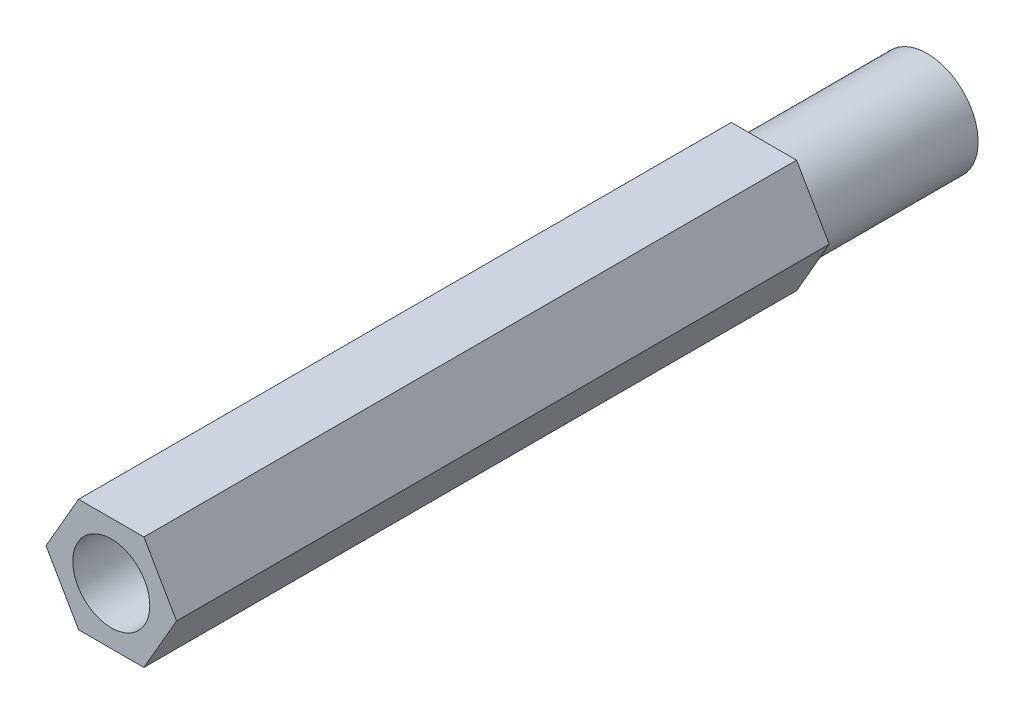
ISO-10303-21;
HEADER;
FILE_DESCRIPTION(('STEP AP214'),'2;1');
FILE_NAME('part.step','',(''),(''),'','','');
FILE_SCHEMA(('AUTOMOTIVE_DESIGN { 1 0 10303 214 1 1 1 1 }'));
ENDSEC;
DATA;
#1=APPLICATION_CONTEXT('core data for automotive mechanical design processes');
#2=APPLICATION_PROTOCOL_DEFINITION('international standard','automotive_design',2000,#1);
#3=PRODUCT_CONTEXT('',#1,'mechanical');
#4=PRODUCT('Part','Part','',(#3));
#5=PRODUCT_RELATED_PRODUCT_CATEGORY('part','',(#4));
#6=PRODUCT_DEFINITION_FORMATION('','',#4);
#7=PRODUCT_DEFINITION_CONTEXT('part definition',#1,'design');
#8=PRODUCT_DEFINITION('design','',#6,#7);
#9=PRODUCT_DEFINITION_SHAPE('','',#8);
#10=(LENGTH_UNIT() NAMED_UNIT(*) SI_UNIT(.MILLI.,.METRE.));
#11=(NAMED_UNIT(*) PLANE_ANGLE_UNIT() SI_UNIT($,.RADIAN.));
#12=(NAMED_UNIT(*) SI_UNIT($,.STERADIAN.) SOLID_ANGLE_UNIT());
#13=UNCERTAINTY_MEASURE_WITH_UNIT(LENGTH_MEASURE(1.E-05),#10,'distance_accuracy_value','');
#14=(GEOMETRIC_REPRESENTATION_CONTEXT(3) GLOBAL_UNCERTAINTY_ASSIGNED_CONTEXT((#13)) GLOBAL_UNIT_ASSIGNED_CONTEXT((#10,
#11,#12)) REPRESENTATION_CONTEXT('',''));
#15=CARTESIAN_POINT('',(0.,0.,0.));
#16=DIRECTION('',(0.,0.,1.));
#17=DIRECTION('',(1.,0.,0.));
#18=AXIS2_PLACEMENT_3D('',#15,#16,#17);
#19=CARTESIAN_POINT('',(2.53999999999999,-4.39940905122495,63.5));
#20=DIRECTION('',(-0.866025403784439,0.5,0.));
#21=DIRECTION('',(-0.5,-0.866025403784439,0.));
#22=AXIS2_PLACEMENT_3D('',#19,#20,#21);
#23=PLANE('',#22);
#24=DIRECTION('',(-0.499999999999999,-0.866025403784439,0.));
#25=VECTOR('',#24,1.);
#26=CARTESIAN_POINT('',(5.08,0.,12.7));
#27=LINE('',#26,#25);
#28=CARTESIAN_POINT('',(5.08,0.,12.7));
#29=VERTEX_POINT('',#28);
#30=CARTESIAN_POINT('',(2.53999999999999,-4.39940905122495,12.7));
#31=VERTEX_POINT('',#30);
#32=EDGE_CURVE('E51',#29,#31,#27,.T.);
#33=ORIENTED_EDGE('',*,*,#32,.F.);
#34=DIRECTION('',(0.,0.,-1.));
#35=VECTOR('',#34,1.);
#36=CARTESIAN_POINT('',(5.08,0.,63.5));
#37=LINE('',#36,#35);
#38=CARTESIAN_POINT('',(5.08,0.,63.5));
#39=VERTEX_POINT('',#38);
#40=EDGE_CURVE('E11',#39,#29,#37,.T.);
#41=ORIENTED_EDGE('',*,*,#40,.F.);
#42=DIRECTION('',(0.5,0.866025403784439,0.));
#43=VECTOR('',#42,1.);
#44=CARTESIAN_POINT('',(2.53999999999999,-4.39940905122495,63.5));
#45=LINE('',#44,#43);
#46=CARTESIAN_POINT('',(2.53999999999999,-4.39940905122495,63.5));
#47=VERTEX_POINT('',#46);
#48=EDGE_CURVE('E141',#47,#39,#45,.T.);
#49=ORIENTED_EDGE('',*,*,#48,.F.);
#50=DIRECTION('',(0.,0.,-1.));
#51=VECTOR('',#50,1.);
#52=CARTESIAN_POINT('',(2.53999999999999,-4.39940905122495,63.5));
#53=LINE('',#52,#51);
#54=EDGE_CURVE('E116',#47,#31,#53,.T.);
#55=ORIENTED_EDGE('',*,*,#54,.T.);
#56=EDGE_LOOP('',(#33,#41,#49,#55));
#57=FACE_BOUND('',#56,.T.);
#58=ADVANCED_FACE('F32',(#57),#23,.F.);
#59=CARTESIAN_POINT('',(5.08,0.,63.5));
#60=DIRECTION('',(-0.866025403784439,-0.5,0.));
#61=DIRECTION('',(0.5,-0.866025403784439,0.));
#62=AXIS2_PLACEMENT_3D('',#59,#60,#61);
#63=PLANE('',#62);
#64=DIRECTION('',(0.5,-0.866025403784439,0.));
#65=VECTOR('',#64,1.);
#66=CARTESIAN_POINT('',(2.54,4.39940905122496,12.7));
#67=LINE('',#66,#65);
#68=CARTESIAN_POINT('',(2.54,4.39940905122496,12.7));
#69=VERTEX_POINT('',#68);
#70=EDGE_CURVE('E130',#69,#29,#67,.T.);
#71=ORIENTED_EDGE('',*,*,#70,.F.);
#72=DIRECTION('',(0.,0.,-1.));
#73=VECTOR('',#72,1.);
#74=CARTESIAN_POINT('',(2.54,4.39940905122495,63.5));
#75=LINE('',#74,#73);
#76=CARTESIAN_POINT('',(2.54,4.39940905122495,63.5));
#77=VERTEX_POINT('',#76);
#78=EDGE_CURVE('E44',#77,#69,#75,.T.);
#79=ORIENTED_EDGE('',*,*,#78,.F.);
#80=DIRECTION('',(-0.5,0.866025403784439,0.));
#81=VECTOR('',#80,1.);
#82=CARTESIAN_POINT('',(5.08,0.,63.5));
#83=LINE('',#82,#81);
#84=EDGE_CURVE('E129',#39,#77,#83,.T.);
#85=ORIENTED_EDGE('',*,*,#84,.F.);
#86=ORIENTED_EDGE('',*,*,#40,.T.);
#87=EDGE_LOOP('',(#71,#79,#85,#86));
#88=FACE_BOUND('',#87,.T.);
#89=ADVANCED_FACE('F128',(#88),#63,.F.);
#90=CARTESIAN_POINT('',(2.54,4.39940905122495,63.5));
#91=DIRECTION('',(0.,-1.,0.));
#92=DIRECTION('',(1.,0.,0.));
#93=AXIS2_PLACEMENT_3D('',#90,#91,#92);
#94=PLANE('',#93);
#95=DIRECTION('',(1.,0.,0.));
#96=VECTOR('',#95,1.);
#97=CARTESIAN_POINT('',(-2.54000000000001,4.39940905122495,12.7));
#98=LINE('',#97,#96);
#99=CARTESIAN_POINT('',(-2.54000000000001,4.39940905122495,12.7));
#100=VERTEX_POINT('',#99);
#101=EDGE_CURVE('E109',#100,#69,#98,.T.);
#102=ORIENTED_EDGE('',*,*,#101,.F.);
#103=DIRECTION('',(0.,0.,-1.));
#104=VECTOR('',#103,1.);
#105=CARTESIAN_POINT('',(-2.54,4.39940905122495,63.5));
#106=LINE('',#105,#104);
#107=CARTESIAN_POINT('',(-2.54,4.39940905122495,63.5));
#108=VERTEX_POINT('',#107);
#109=EDGE_CURVE('E108',#108,#100,#106,.T.);
#110=ORIENTED_EDGE('',*,*,#109,.F.);
#111=DIRECTION('',(-1.,0.,0.));
#112=VECTOR('',#111,1.);
#113=CARTESIAN_POINT('',(2.54,4.39940905122495,63.5));
#114=LINE('',#113,#112);
#115=EDGE_CURVE('E125',#77,#108,#114,.T.);
#116=ORIENTED_EDGE('',*,*,#115,.F.);
#117=ORIENTED_EDGE('',*,*,#78,.T.);
#118=EDGE_LOOP('',(#102,#110,#116,#117));
#119=FACE_BOUND('',#118,.T.);
#120=ADVANCED_FACE('F124',(#119),#94,.F.);
#121=CARTESIAN_POINT('',(-2.54,4.39940905122495,63.5));
#122=DIRECTION('',(0.866025403784438,-0.5,0.));
#123=DIRECTION('',(0.5,0.866025403784438,0.));
#124=AXIS2_PLACEMENT_3D('',#121,#122,#123);
#125=PLANE('',#124);
#126=CARTESIAN_POINT('',(-3.81,2.19970452561248,57.15));
#127=DIRECTION('',(-0.866025403784439,0.5,0.));
#128=DIRECTION('',(-0.5,-0.866025403784438,0.));
#129=AXIS2_PLACEMENT_3D('',#126,#127,#128);
#130=CIRCLE('',#129,1.27);
#131=CARTESIAN_POINT('',(-4.445,1.09985226280624,57.15));
#132=VERTEX_POINT('',#131);
#133=EDGE_CURVE('E182',#132,#132,#130,.T.);
#134=ORIENTED_EDGE('',*,*,#133,.F.);
#135=EDGE_LOOP('',(#134));
#136=FACE_BOUND('',#135,.T.);
#137=DIRECTION('',(0.499999999999999,0.866025403784439,0.));
#138=VECTOR('',#137,1.);
#139=CARTESIAN_POINT('',(-5.08,0.,12.7));
#140=LINE('',#139,#138);
#141=CARTESIAN_POINT('',(-5.08,0.,12.7));
#142=VERTEX_POINT('',#141);
#143=EDGE_CURVE('E91',#142,#100,#140,.T.);
#144=ORIENTED_EDGE('',*,*,#143,.F.);
#145=DIRECTION('',(0.,0.,-1.));
#146=VECTOR('',#145,1.);
#147=CARTESIAN_POINT('',(-5.08,0.,63.5));
#148=LINE('',#147,#146);
#149=CARTESIAN_POINT('',(-5.08,0.,63.5));
#150=VERTEX_POINT('',#149);
#151=EDGE_CURVE('E105',#150,#142,#148,.T.);
#152=ORIENTED_EDGE('',*,*,#151,.F.);
#153=DIRECTION('',(-0.5,-0.866025403784438,0.));
#154=VECTOR('',#153,1.);
#155=CARTESIAN_POINT('',(-2.54,4.39940905122495,63.5));
#156=LINE('',#155,#154);
#157=EDGE_CURVE('E147',#108,#150,#156,.T.);
#158=ORIENTED_EDGE('',*,*,#157,.F.);
#159=ORIENTED_EDGE('',*,*,#109,.T.);
#160=EDGE_LOOP('',(#144,#152,#158,#159));
#161=FACE_BOUND('',#160,.T.);
#162=ADVANCED_FACE('F103',(#136,#161),#125,.F.);
#163=CARTESIAN_POINT('',(-5.08,0.,63.5));
#164=DIRECTION('',(0.866025403784438,0.5,0.));
#165=DIRECTION('',(-0.5,0.866025403784439,0.));
#166=AXIS2_PLACEMENT_3D('',#163,#164,#165);
#167=PLANE('',#166);
#168=DIRECTION('',(-0.5,0.866025403784439,0.));
#169=VECTOR('',#168,1.);
#170=CARTESIAN_POINT('',(-2.54,-4.39940905122496,12.7));
#171=LINE('',#170,#169);
#172=CARTESIAN_POINT('',(-2.54,-4.39940905122496,12.7));
#173=VERTEX_POINT('',#172);
#174=EDGE_CURVE('E88',#173,#142,#171,.T.);
#175=ORIENTED_EDGE('',*,*,#174,.F.);
#176=DIRECTION('',(0.,0.,-1.));
#177=VECTOR('',#176,1.);
#178=CARTESIAN_POINT('',(-2.54,-4.39940905122495,63.5));
#179=LINE('',#178,#177);
#180=CARTESIAN_POINT('',(-2.54,-4.39940905122495,63.5));
#181=VERTEX_POINT('',#180);
#182=EDGE_CURVE('E113',#181,#173,#179,.T.);
#183=ORIENTED_EDGE('',*,*,#182,.F.);
#184=DIRECTION('',(0.5,-0.866025403784438,0.));
#185=VECTOR('',#184,1.);
#186=CARTESIAN_POINT('',(-5.08,0.,63.5));
#187=LINE('',#186,#185);
#188=EDGE_CURVE('E112',#150,#181,#187,.T.);
#189=ORIENTED_EDGE('',*,*,#188,.F.);
#190=ORIENTED_EDGE('',*,*,#151,.T.);
#191=EDGE_LOOP('',(#175,#183,#189,#190));
#192=FACE_BOUND('',#191,.T.);
#193=ADVANCED_FACE('F111',(#192),#167,.F.);
#194=CARTESIAN_POINT('',(-2.54,-4.39940905122495,63.5));
#195=DIRECTION('',(0.,1.,0.));
#196=DIRECTION('',(0.,0.,1.));
#197=AXIS2_PLACEMENT_3D('',#194,#195,#196);
#198=PLANE('',#197);
#199=DIRECTION('',(-1.,0.,0.));
#200=VECTOR('',#199,1.);
#201=CARTESIAN_POINT('',(2.54000000000001,-4.39940905122495,12.7));
#202=LINE('',#201,#200);
#203=EDGE_CURVE('E93',#31,#173,#202,.T.);
#204=ORIENTED_EDGE('',*,*,#203,.F.);
#205=ORIENTED_EDGE('',*,*,#54,.F.);
#206=DIRECTION('',(1.,0.,0.));
#207=VECTOR('',#206,1.);
#208=CARTESIAN_POINT('',(-2.54,-4.39940905122495,63.5));
#209=LINE('',#208,#207);
#210=EDGE_CURVE('E59',#181,#47,#209,.T.);
#211=ORIENTED_EDGE('',*,*,#210,.F.);
#212=ORIENTED_EDGE('',*,*,#182,.T.);
#213=EDGE_LOOP('',(#204,#205,#211,#212));
#214=FACE_BOUND('',#213,.T.);
#215=ADVANCED_FACE('F154',(#214),#198,.F.);
#216=CARTESIAN_POINT('',(0.,0.,63.5));
#217=DIRECTION('',(0.,0.,1.));
#218=DIRECTION('',(1.,0.,0.));
#219=AXIS2_PLACEMENT_3D('',#216,#217,#218);
#220=PLANE('',#219);
#221=CARTESIAN_POINT('',(0.,0.,63.5));
#222=DIRECTION('',(0.,0.,1.));
#223=DIRECTION('',(1.,0.,0.));
#224=AXIS2_PLACEMENT_3D('',#221,#222,#223);
#225=CIRCLE('',#224,2.9972);
#226=CARTESIAN_POINT('',(2.9972,0.,63.5));
#227=VERTEX_POINT('',#226);
#228=EDGE_CURVE('E137',#227,#227,#225,.T.);
#229=ORIENTED_EDGE('',*,*,#228,.F.);
#230=EDGE_LOOP('',(#229));
#231=FACE_BOUND('',#230,.T.);
#232=ORIENTED_EDGE('',*,*,#48,.T.);
#233=ORIENTED_EDGE('',*,*,#84,.T.);
#234=ORIENTED_EDGE('',*,*,#115,.T.);
#235=ORIENTED_EDGE('',*,*,#157,.T.);
#236=ORIENTED_EDGE('',*,*,#188,.T.);
#237=ORIENTED_EDGE('',*,*,#210,.T.);
#238=EDGE_LOOP('',(#232,#233,#234,#235,#236,#237));
#239=FACE_BOUND('',#238,.T.);
#240=ADVANCED_FACE('F156',(#231,#239),#220,.T.);
#241=CARTESIAN_POINT('',(0.,0.,50.8));
#242=DIRECTION('',(0.,0.,1.));
#243=DIRECTION('',(1.,0.,0.));
#244=AXIS2_PLACEMENT_3D('',#241,#242,#243);
#245=CYLINDRICAL_SURFACE('',#244,2.9972);
#246=CARTESIAN_POINT('',(-2.98611268977053,0.257563281527925,57.15));
#247=CARTESIAN_POINT('',(-2.98611545407586,0.257574022506549,57.2176201425007));
#248=CARTESIAN_POINT('',(-2.98561522344909,0.26355163267711,57.285345784912));
#249=CARTESIAN_POINT('',(-2.98343815011913,0.287114445370234,57.4188354032829));
#250=CARTESIAN_POINT('',(-2.98175816235302,0.304730667311553,57.4845936447797));
#251=CARTESIAN_POINT('',(-2.97673168311902,0.350425928411157,57.6119730911407));
#252=CARTESIAN_POINT('',(-2.97339212524053,0.378461315039854,57.6736103079598));
#253=CARTESIAN_POINT('',(-2.96437040159875,0.443613829315719,57.791639415553));
#254=CARTESIAN_POINT('',(-2.95868873411825,0.480729024555286,57.8480324189055));
#255=CARTESIAN_POINT('',(-2.94379464468999,0.564989293197485,57.9576372215729));
#256=CARTESIAN_POINT('',(-2.9343953571641,0.612593621598576,58.0104707460775));
#257=CARTESIAN_POINT('',(-2.91122312605734,0.714650104076469,58.1079666761714));
#258=CARTESIAN_POINT('',(-2.89744846803,0.769104937397094,58.1526258678972));
#259=CARTESIAN_POINT('',(-2.8640207843483,0.885679048455887,58.2344582606913));
#260=CARTESIAN_POINT('',(-2.84413053679321,0.948033305334026,58.2712026950389));
#261=CARTESIAN_POINT('',(-2.79819076649236,1.07608173111693,58.3332482270745));
#262=CARTESIAN_POINT('',(-2.7721440749411,1.14177435392202,58.3585545693219));
#263=CARTESIAN_POINT('',(-2.71545016084742,1.27051830629957,58.395624798833));
#264=CARTESIAN_POINT('',(-2.68512435218706,1.3335224802942,58.4080418492511));
#265=CARTESIAN_POINT('',(-2.61953189753511,1.45815325997472,58.421094735782));
#266=CARTESIAN_POINT('',(-2.58426733457023,1.51978043379898,58.4217355238003));
#267=CARTESIAN_POINT('',(-2.51228713964318,1.6358466748939,58.4115530244553));
#268=CARTESIAN_POINT('',(-2.47580229992508,1.69049405180217,58.4014482901532));
#269=CARTESIAN_POINT('',(-2.40077643898764,1.79545075037804,58.3712975195701));
#270=CARTESIAN_POINT('',(-2.36223526613809,1.84575975142422,58.351250749275));
#271=CARTESIAN_POINT('',(-2.28395790048511,1.94181485748086,58.3015511861198));
#272=CARTESIAN_POINT('',(-2.24421244608976,1.98747941557878,58.2717561760999));
#273=CARTESIAN_POINT('',(-2.16566899553722,2.07278868327693,58.2035481976445));
#274=CARTESIAN_POINT('',(-2.12687134318504,2.11243123488945,58.1651321520179));
#275=CARTESIAN_POINT('',(-2.04908420933425,2.18806188901358,58.0775344382255));
#276=CARTESIAN_POINT('',(-2.01028500343909,2.22357623497806,58.0277739449815));
#277=CARTESIAN_POINT('',(-1.93756632663506,2.2872220582184,57.9205246295941));
#278=CARTESIAN_POINT('',(-1.90364887119974,2.31535049008301,57.8630326342722));
#279=CARTESIAN_POINT('',(-1.84164598415851,2.36499137479157,57.7394197708855));
#280=CARTESIAN_POINT('',(-1.81380597976839,2.38623806473993,57.6730674561003));
#281=CARTESIAN_POINT('',(-1.76770639869616,2.42059045767216,57.5351391423763));
#282=CARTESIAN_POINT('',(-1.74943970045676,2.43370221355078,57.4635670716808));
#283=CARTESIAN_POINT('',(-1.7250217904165,2.45106487128554,57.3223018474273));
#284=CARTESIAN_POINT('',(-1.71814636107071,2.4558465350687,57.2527997176326));
#285=CARTESIAN_POINT('',(-1.71486086376588,2.45814295944753,57.1134403617425));
#286=CARTESIAN_POINT('',(-1.71844696402396,2.45566038074299,57.0435832750151));
#287=CARTESIAN_POINT('',(-1.73514673300354,2.44388281730207,56.9104483142434));
#288=CARTESIAN_POINT('',(-1.7476038951906,2.4350568797854,56.847043797287));
#289=CARTESIAN_POINT('',(-1.78036137740699,2.41120894025357,56.7235190847502));
#290=CARTESIAN_POINT('',(-1.8006635727692,2.39618545667456,56.6633996783913));
#291=CARTESIAN_POINT('',(-1.84880735744915,2.3592529635828,56.5452572804874));
#292=CARTESIAN_POINT('',(-1.87693581329447,2.33707545081563,56.4874358607684));
#293=CARTESIAN_POINT('',(-1.93864385308459,2.28614671212943,56.3779127267271));
#294=CARTESIAN_POINT('',(-1.97222585101057,2.25739257278934,56.3262137400719));
#295=CARTESIAN_POINT('',(-2.04619713439561,2.1906546082472,56.2258410253272));
#296=CARTESIAN_POINT('',(-2.0869221240349,2.152095129311,56.1777949278022));
#297=CARTESIAN_POINT('',(-2.17075604283039,2.06750295426342,56.0912859079754));
#298=CARTESIAN_POINT('',(-2.21386518331968,2.02146959495889,56.0528238368785));
#299=CARTESIAN_POINT('',(-2.30056800653326,1.92222465733803,55.9865674828726));
#300=CARTESIAN_POINT('',(-2.34416292603085,1.86898565706834,55.9588155937559));
#301=CARTESIAN_POINT('',(-2.42957447391454,1.75651604798428,55.9153382163786));
#302=CARTESIAN_POINT('',(-2.4713921857735,1.69728916631805,55.8996052984808));
#303=CARTESIAN_POINT('',(-2.54849279214402,1.57893017209268,55.8815711995633));
#304=CARTESIAN_POINT('',(-2.58402933965402,1.52009711787515,55.8783860178293));
#305=CARTESIAN_POINT('',(-2.65077118171049,1.40046701645339,55.8831429261399));
#306=CARTESIAN_POINT('',(-2.68197728108501,1.33967033679163,55.891082945477));
#307=CARTESIAN_POINT('',(-2.73826254668515,1.22037603345276,55.9172302080085));
#308=CARTESIAN_POINT('',(-2.76352803800236,1.16187795950388,55.935039976114));
#309=CARTESIAN_POINT('',(-2.8092121485384,1.04660526998278,55.9799798699501));
#310=CARTESIAN_POINT('',(-2.82962986248877,0.98983097803126,56.0071117341671));
#311=CARTESIAN_POINT('',(-2.86663306667504,0.877098892777195,56.0713003130803));
#312=CARTESIAN_POINT('',(-2.88300205190951,0.821295649473427,56.1087522671206));
#313=CARTESIAN_POINT('',(-2.91119570386717,0.714967261388916,56.1919507446353));
#314=CARTESIAN_POINT('',(-2.92301861059061,0.664444166301819,56.237700470498));
#315=CARTESIAN_POINT('',(-2.94354977183542,0.566904087602746,56.3400082948917));
#316=CARTESIAN_POINT('',(-2.95197843097262,0.520388176830521,56.3971021310575));
#317=CARTESIAN_POINT('',(-2.96545900451056,0.437090587161059,56.5184290164908));
#318=CARTESIAN_POINT('',(-2.97050899040407,0.400314474849297,56.5826661186997));
#319=CARTESIAN_POINT('',(-2.97818417099584,0.338523131749639,56.7164663884772));
#320=CARTESIAN_POINT('',(-2.98081739450667,0.313469095636333,56.7860110832472));
#321=CARTESIAN_POINT('',(-2.984464801805,0.276649175571403,56.9284342272623));
#322=CARTESIAN_POINT('',(-2.98548442055845,0.264838723744544,57.0013006312637));
#323=CARTESIAN_POINT('',(-2.98604082771534,0.258383324097309,57.0996344489247));
#324=CARTESIAN_POINT('',(-2.98611166000168,0.257559280260387,57.1248099041507));
#325=CARTESIAN_POINT('',(-2.98611268977053,0.257563281527925,57.15));
#326=B_SPLINE_CURVE_WITH_KNOTS('',3,(#246,#247,#248,#249,#250,#251,#252,#253,#254,#255,#256,
#257,#258,#259,#260,#261,#262,#263,#264,#265,#266,#267,#268,#269,#270,#271,#272,#273,#274,#275,
#276,#277,#278,#279,#280,#281,#282,#283,#284,#285,#286,#287,#288,#289,#290,#291,#292,#293,#294,
#295,#296,#297,#298,#299,#300,#301,#302,#303,#304,#305,#306,#307,#308,#309,#310,#311,#312,#313,
#314,#315,#316,#317,#318,#319,#320,#321,#322,#323,#324,#325),.UNSPECIFIED.,.T.,.F.,(4,2,2,2,2,2,
2,2,2,2,2,2,2,2,2,2,2,2,2,2,2,2,2,2,2,2,2,2,2,2,2,2,2,2,2,2,2,2,2,4),(0.,0.202786302959428,
0.406115267446279,0.608601788186799,0.811045252225837,1.02531474633173,1.23966830364838,
1.46369500106046,1.68761887396464,1.89954059938856,2.11137320991791,2.30988158758006,
2.5084046231678,2.70996368725814,2.91159481056761,3.12785357726566,3.34420137374856,
3.5681149490758,3.79186171840064,4.00074508882727,4.20955196038129,4.40432576522464,
4.59914615902489,4.80235093782655,5.00564591054265,5.22616855759134,5.44671078337461,
5.66811723388739,5.88938670898007,6.09475499338132,6.30008505814547,6.49769089123421,
6.69533359604099,6.90196449517192,7.10867531044334,7.33001322327668,7.55147736566684,
7.77220308250075,7.99218375341824,8.06772642782809),.UNSPECIFIED.);
#327=CARTESIAN_POINT('',(-2.98611268977053,0.257563281527925,57.15));
#328=VERTEX_POINT('',#327);
#329=EDGE_CURVE('E35',#328,#328,#326,.T.);
#330=ORIENTED_EDGE('',*,*,#329,.T.);
#331=EDGE_LOOP('',(#330));
#332=FACE_BOUND('',#331,.T.);
#333=CARTESIAN_POINT('',(0.,0.,50.8));
#334=DIRECTION('',(0.,0.,1.));
#335=DIRECTION('',(1.,0.,0.));
#336=AXIS2_PLACEMENT_3D('',#333,#334,#335);
#337=CIRCLE('',#336,2.9972);
#338=CARTESIAN_POINT('',(2.9972,0.,50.8));
#339=VERTEX_POINT('',#338);
#340=EDGE_CURVE('E138',#339,#339,#337,.T.);
#341=ORIENTED_EDGE('',*,*,#340,.F.);
#342=EDGE_LOOP('',(#341));
#343=FACE_BOUND('',#342,.T.);
#344=ORIENTED_EDGE('',*,*,#228,.T.);
#345=EDGE_LOOP('',(#344));
#346=FACE_BOUND('',#345,.T.);
#347=ADVANCED_FACE('F162',(#332,#343,#346),#245,.F.);
#348=CARTESIAN_POINT('',(0.,0.,50.8));
#349=DIRECTION('',(0.,0.,1.));
#350=DIRECTION('',(1.,0.,0.));
#351=AXIS2_PLACEMENT_3D('',#348,#349,#350);
#352=PLANE('',#351);
#353=ORIENTED_EDGE('',*,*,#340,.T.);
#354=EDGE_LOOP('',(#353));
#355=FACE_BOUND('',#354,.T.);
#356=ADVANCED_FACE('F204',(#355),#352,.T.);
#357=CARTESIAN_POINT('',(0.,0.,12.7));
#358=DIRECTION('',(0.,0.,-1.));
#359=DIRECTION('',(-1.,0.,0.));
#360=AXIS2_PLACEMENT_3D('',#357,#358,#359);
#361=PLANE('',#360);
#362=CARTESIAN_POINT('',(0.,0.,12.7));
#363=DIRECTION('',(0.,0.,-1.));
#364=DIRECTION('',(-1.,0.,0.));
#365=AXIS2_PLACEMENT_3D('',#362,#363,#364);
#366=CIRCLE('',#365,3.96875);
#367=CARTESIAN_POINT('',(-3.96875,0.,12.7));
#368=VERTEX_POINT('',#367);
#369=EDGE_CURVE('E98',#368,#368,#366,.T.);
#370=ORIENTED_EDGE('',*,*,#369,.F.);
#371=EDGE_LOOP('',(#370));
#372=FACE_BOUND('',#371,.T.);
#373=ORIENTED_EDGE('',*,*,#174,.T.);
#374=ORIENTED_EDGE('',*,*,#143,.T.);
#375=ORIENTED_EDGE('',*,*,#101,.T.);
#376=ORIENTED_EDGE('',*,*,#70,.T.);
#377=ORIENTED_EDGE('',*,*,#32,.T.);
#378=ORIENTED_EDGE('',*,*,#203,.T.);
#379=EDGE_LOOP('',(#373,#374,#375,#376,#377,#378));
#380=FACE_BOUND('',#379,.T.);
#381=ADVANCED_FACE('F90',(#372,#380),#361,.T.);
#382=CARTESIAN_POINT('',(0.,0.,12.7));
#383=DIRECTION('',(0.,0.,-1.));
#384=DIRECTION('',(-1.,0.,0.));
#385=AXIS2_PLACEMENT_3D('',#382,#383,#384);
#386=CYLINDRICAL_SURFACE('',#385,3.96875);
#387=ORIENTED_EDGE('',*,*,#369,.T.);
#388=EDGE_LOOP('',(#387));
#389=FACE_BOUND('',#388,.T.);
#390=CARTESIAN_POINT('',(0.,0.,0.));
#391=DIRECTION('',(0.,0.,-1.));
#392=DIRECTION('',(-1.,0.,0.));
#393=AXIS2_PLACEMENT_3D('',#390,#391,#392);
#394=CIRCLE('',#393,3.96875);
#395=CARTESIAN_POINT('',(-3.96875,0.,0.));
#396=VERTEX_POINT('',#395);
#397=EDGE_CURVE('E186',#396,#396,#394,.T.);
#398=ORIENTED_EDGE('',*,*,#397,.F.);
#399=EDGE_LOOP('',(#398));
#400=FACE_BOUND('',#399,.T.);
#401=ADVANCED_FACE('F195',(#389,#400),#386,.T.);
#402=CARTESIAN_POINT('',(0.,0.,0.));
#403=DIRECTION('',(0.,0.,1.));
#404=DIRECTION('',(1.,0.,0.));
#405=AXIS2_PLACEMENT_3D('',#402,#403,#404);
#406=PLANE('',#405);
#407=ORIENTED_EDGE('',*,*,#397,.T.);
#408=EDGE_LOOP('',(#407));
#409=FACE_BOUND('',#408,.T.);
#410=ADVANCED_FACE('F193',(#409),#406,.F.);
#411=CARTESIAN_POINT('',(0.589409051224947,-0.340295474387526,57.15));
#412=DIRECTION('',(-0.866025403784438,0.5,0.));
#413=DIRECTION('',(-0.5,-0.866025403784438,0.));
#414=AXIS2_PLACEMENT_3D('',#411,#412,#413);
#415=CYLINDRICAL_SURFACE('',#414,1.27);
#416=ORIENTED_EDGE('',*,*,#133,.T.);
#417=EDGE_LOOP('',(#416));
#418=FACE_BOUND('',#417,.T.);
#419=ORIENTED_EDGE('',*,*,#329,.F.);
#420=EDGE_LOOP('',(#419));
#421=FACE_BOUND('',#420,.T.);
#422=ADVANCED_FACE('F203',(#418,#421),#415,.F.);
#423=CLOSED_SHELL('',(#58,#89,#120,#162,#193,#215,#240,#347,#356,#381,#401,#410,#422));
#424=MANIFOLD_SOLID_BREP('B2',#423);
#425=ADVANCED_BREP_SHAPE_REPRESENTATION('',(#18,#424),#14);
#426=SHAPE_DEFINITION_REPRESENTATION(#9,#425);
ENDSEC;
END-ISO-10303-21;
